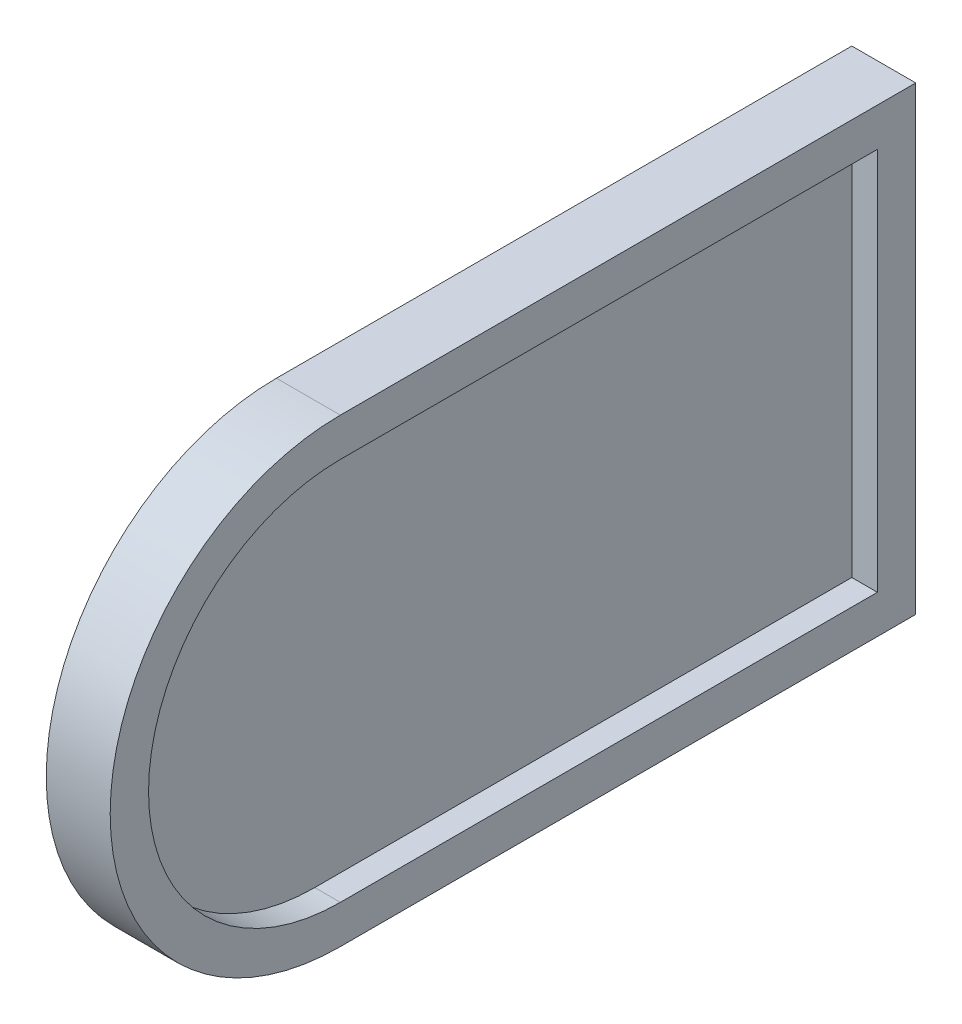
ISO-10303-21;
HEADER;
FILE_DESCRIPTION(('STEP AP214'),'2;1');
FILE_NAME('part.step','',(''),(''),'','','');
FILE_SCHEMA(('AUTOMOTIVE_DESIGN { 1 0 10303 214 1 1 1 1 }'));
ENDSEC;
DATA;
#1=APPLICATION_CONTEXT('core data for automotive mechanical design processes');
#2=APPLICATION_PROTOCOL_DEFINITION('international standard','automotive_design',2000,#1);
#3=PRODUCT_CONTEXT('',#1,'mechanical');
#4=PRODUCT('Part','Part','',(#3));
#5=PRODUCT_RELATED_PRODUCT_CATEGORY('part','',(#4));
#6=PRODUCT_DEFINITION_FORMATION('','',#4);
#7=PRODUCT_DEFINITION_CONTEXT('part definition',#1,'design');
#8=PRODUCT_DEFINITION('design','',#6,#7);
#9=PRODUCT_DEFINITION_SHAPE('','',#8);
#10=(LENGTH_UNIT() NAMED_UNIT(*) SI_UNIT(.MILLI.,.METRE.));
#11=(NAMED_UNIT(*) PLANE_ANGLE_UNIT() SI_UNIT($,.RADIAN.));
#12=(NAMED_UNIT(*) SI_UNIT($,.STERADIAN.) SOLID_ANGLE_UNIT());
#13=UNCERTAINTY_MEASURE_WITH_UNIT(LENGTH_MEASURE(1.E-05),#10,'distance_accuracy_value','');
#14=(GEOMETRIC_REPRESENTATION_CONTEXT(3) GLOBAL_UNCERTAINTY_ASSIGNED_CONTEXT((#13)) GLOBAL_UNIT_ASSIGNED_CONTEXT((#10,
#11,#12)) REPRESENTATION_CONTEXT('',''));
#15=CARTESIAN_POINT('',(0.,0.,0.));
#16=DIRECTION('',(0.,0.,1.));
#17=DIRECTION('',(1.,0.,0.));
#18=AXIS2_PLACEMENT_3D('',#15,#16,#17);
#19=CARTESIAN_POINT('',(5.,0.,0.));
#20=DIRECTION('',(-1.,0.,0.));
#21=DIRECTION('',(0.,0.,1.));
#22=AXIS2_PLACEMENT_3D('',#19,#20,#21);
#23=CYLINDRICAL_SURFACE('',#22,18.);
#24=CARTESIAN_POINT('',(0.,0.,0.));
#25=DIRECTION('',(1.,0.,0.));
#26=DIRECTION('',(0.,0.,-1.));
#27=AXIS2_PLACEMENT_3D('',#24,#25,#26);
#28=CIRCLE('',#27,18.);
#29=CARTESIAN_POINT('',(0.,18.,0.));
#30=VERTEX_POINT('',#29);
#31=CARTESIAN_POINT('',(0.,-18.,0.));
#32=VERTEX_POINT('',#31);
#33=EDGE_CURVE('E151',#30,#32,#28,.T.);
#34=ORIENTED_EDGE('',*,*,#33,.T.);
#35=DIRECTION('',(-1.,0.,0.));
#36=VECTOR('',#35,1.);
#37=CARTESIAN_POINT('',(5.,-18.,0.));
#38=LINE('',#37,#36);
#39=CARTESIAN_POINT('',(5.,-18.,0.));
#40=VERTEX_POINT('',#39);
#41=EDGE_CURVE('E11',#40,#32,#38,.T.);
#42=ORIENTED_EDGE('',*,*,#41,.F.);
#43=CARTESIAN_POINT('',(5.,0.,0.));
#44=DIRECTION('',(1.,0.,0.));
#45=DIRECTION('',(0.,0.,-1.));
#46=AXIS2_PLACEMENT_3D('',#43,#44,#45);
#47=CIRCLE('',#46,18.);
#48=CARTESIAN_POINT('',(5.,18.,0.));
#49=VERTEX_POINT('',#48);
#50=EDGE_CURVE('E144',#49,#40,#47,.T.);
#51=ORIENTED_EDGE('',*,*,#50,.F.);
#52=DIRECTION('',(-1.,0.,0.));
#53=VECTOR('',#52,1.);
#54=CARTESIAN_POINT('',(5.,18.,0.));
#55=LINE('',#54,#53);
#56=EDGE_CURVE('E150',#49,#30,#55,.T.);
#57=ORIENTED_EDGE('',*,*,#56,.T.);
#58=EDGE_LOOP('',(#34,#42,#51,#57));
#59=FACE_BOUND('',#58,.T.);
#60=ADVANCED_FACE('F37',(#59),#23,.T.);
#61=CARTESIAN_POINT('',(5.,-18.,-45.));
#62=DIRECTION('',(0.,1.,0.));
#63=DIRECTION('',(0.,0.,1.));
#64=AXIS2_PLACEMENT_3D('',#61,#62,#63);
#65=PLANE('',#64);
#66=DIRECTION('',(0.,0.,-1.));
#67=VECTOR('',#66,1.);
#68=CARTESIAN_POINT('',(0.,-18.,-45.));
#69=LINE('',#68,#67);
#70=CARTESIAN_POINT('',(0.,-18.,-45.));
#71=VERTEX_POINT('',#70);
#72=EDGE_CURVE('E154',#32,#71,#69,.T.);
#73=ORIENTED_EDGE('',*,*,#72,.T.);
#74=DIRECTION('',(-1.,0.,0.));
#75=VECTOR('',#74,1.);
#76=CARTESIAN_POINT('',(5.,-18.,-45.));
#77=LINE('',#76,#75);
#78=CARTESIAN_POINT('',(5.,-18.,-45.));
#79=VERTEX_POINT('',#78);
#80=EDGE_CURVE('E44',#79,#71,#77,.T.);
#81=ORIENTED_EDGE('',*,*,#80,.F.);
#82=DIRECTION('',(0.,0.,-1.));
#83=VECTOR('',#82,1.);
#84=CARTESIAN_POINT('',(5.,-18.,-45.));
#85=LINE('',#84,#83);
#86=EDGE_CURVE('E88',#40,#79,#85,.T.);
#87=ORIENTED_EDGE('',*,*,#86,.F.);
#88=ORIENTED_EDGE('',*,*,#41,.T.);
#89=EDGE_LOOP('',(#73,#81,#87,#88));
#90=FACE_BOUND('',#89,.T.);
#91=ADVANCED_FACE('F183',(#90),#65,.F.);
#92=CARTESIAN_POINT('',(5.,18.,-45.));
#93=DIRECTION('',(0.,0.,1.));
#94=DIRECTION('',(1.,0.,0.));
#95=AXIS2_PLACEMENT_3D('',#92,#93,#94);
#96=PLANE('',#95);
#97=DIRECTION('',(0.,1.,0.));
#98=VECTOR('',#97,1.);
#99=CARTESIAN_POINT('',(0.,18.,-45.));
#100=LINE('',#99,#98);
#101=CARTESIAN_POINT('',(0.,18.,-45.));
#102=VERTEX_POINT('',#101);
#103=EDGE_CURVE('E156',#71,#102,#100,.T.);
#104=ORIENTED_EDGE('',*,*,#103,.T.);
#105=DIRECTION('',(-1.,0.,0.));
#106=VECTOR('',#105,1.);
#107=CARTESIAN_POINT('',(5.,18.,-45.));
#108=LINE('',#107,#106);
#109=CARTESIAN_POINT('',(5.,18.,-45.));
#110=VERTEX_POINT('',#109);
#111=EDGE_CURVE('E160',#110,#102,#108,.T.);
#112=ORIENTED_EDGE('',*,*,#111,.F.);
#113=DIRECTION('',(0.,1.,0.));
#114=VECTOR('',#113,1.);
#115=CARTESIAN_POINT('',(5.,18.,-45.));
#116=LINE('',#115,#114);
#117=EDGE_CURVE('E147',#79,#110,#116,.T.);
#118=ORIENTED_EDGE('',*,*,#117,.F.);
#119=ORIENTED_EDGE('',*,*,#80,.T.);
#120=EDGE_LOOP('',(#104,#112,#118,#119));
#121=FACE_BOUND('',#120,.T.);
#122=ADVANCED_FACE('F165',(#121),#96,.F.);
#123=CARTESIAN_POINT('',(5.,18.,0.));
#124=DIRECTION('',(0.,-1.,0.));
#125=DIRECTION('',(0.,0.,-1.));
#126=AXIS2_PLACEMENT_3D('',#123,#124,#125);
#127=PLANE('',#126);
#128=DIRECTION('',(0.,0.,1.));
#129=VECTOR('',#128,1.);
#130=CARTESIAN_POINT('',(0.,18.,0.));
#131=LINE('',#130,#129);
#132=EDGE_CURVE('E81',#102,#30,#131,.T.);
#133=ORIENTED_EDGE('',*,*,#132,.T.);
#134=ORIENTED_EDGE('',*,*,#56,.F.);
#135=DIRECTION('',(0.,0.,1.));
#136=VECTOR('',#135,1.);
#137=CARTESIAN_POINT('',(5.,18.,0.));
#138=LINE('',#137,#136);
#139=EDGE_CURVE('E60',#110,#49,#138,.T.);
#140=ORIENTED_EDGE('',*,*,#139,.F.);
#141=ORIENTED_EDGE('',*,*,#111,.T.);
#142=EDGE_LOOP('',(#133,#134,#140,#141));
#143=FACE_BOUND('',#142,.T.);
#144=ADVANCED_FACE('F173',(#143),#127,.F.);
#145=CARTESIAN_POINT('',(5.,0.,0.));
#146=DIRECTION('',(1.,0.,0.));
#147=DIRECTION('',(0.,0.,-1.));
#148=AXIS2_PLACEMENT_3D('',#145,#146,#147);
#149=PLANE('',#148);
#150=CARTESIAN_POINT('',(5.,0.,0.));
#151=DIRECTION('',(1.,0.,0.));
#152=DIRECTION('',(0.,0.,-1.));
#153=AXIS2_PLACEMENT_3D('',#150,#151,#152);
#154=CIRCLE('',#153,15.);
#155=CARTESIAN_POINT('',(5.,15.,0.));
#156=VERTEX_POINT('',#155);
#157=CARTESIAN_POINT('',(5.,-15.,0.));
#158=VERTEX_POINT('',#157);
#159=EDGE_CURVE('E133',#156,#158,#154,.T.);
#160=ORIENTED_EDGE('',*,*,#159,.F.);
#161=DIRECTION('',(0.,0.,1.));
#162=VECTOR('',#161,1.);
#163=CARTESIAN_POINT('',(5.,15.,0.));
#164=LINE('',#163,#162);
#165=CARTESIAN_POINT('',(5.,15.,-42.));
#166=VERTEX_POINT('',#165);
#167=EDGE_CURVE('E142',#166,#156,#164,.T.);
#168=ORIENTED_EDGE('',*,*,#167,.F.);
#169=DIRECTION('',(0.,1.,0.));
#170=VECTOR('',#169,1.);
#171=CARTESIAN_POINT('',(5.,18.,-42.));
#172=LINE('',#171,#170);
#173=CARTESIAN_POINT('',(5.,-15.,-42.));
#174=VERTEX_POINT('',#173);
#175=EDGE_CURVE('E140',#174,#166,#172,.T.);
#176=ORIENTED_EDGE('',*,*,#175,.F.);
#177=DIRECTION('',(0.,0.,-1.));
#178=VECTOR('',#177,1.);
#179=CARTESIAN_POINT('',(5.,-15.,-45.));
#180=LINE('',#179,#178);
#181=EDGE_CURVE('E125',#158,#174,#180,.T.);
#182=ORIENTED_EDGE('',*,*,#181,.F.);
#183=EDGE_LOOP('',(#160,#168,#176,#182));
#184=FACE_BOUND('',#183,.T.);
#185=ORIENTED_EDGE('',*,*,#50,.T.);
#186=ORIENTED_EDGE('',*,*,#86,.T.);
#187=ORIENTED_EDGE('',*,*,#117,.T.);
#188=ORIENTED_EDGE('',*,*,#139,.T.);
#189=EDGE_LOOP('',(#185,#186,#187,#188));
#190=FACE_BOUND('',#189,.T.);
#191=ADVANCED_FACE('F175',(#184,#190),#149,.T.);
#192=CARTESIAN_POINT('',(0.,0.,0.));
#193=DIRECTION('',(1.,0.,0.));
#194=DIRECTION('',(0.,0.,-1.));
#195=AXIS2_PLACEMENT_3D('',#192,#193,#194);
#196=PLANE('',#195);
#197=ORIENTED_EDGE('',*,*,#33,.F.);
#198=ORIENTED_EDGE('',*,*,#132,.F.);
#199=ORIENTED_EDGE('',*,*,#103,.F.);
#200=ORIENTED_EDGE('',*,*,#72,.F.);
#201=EDGE_LOOP('',(#197,#198,#199,#200));
#202=FACE_BOUND('',#201,.T.);
#203=ADVANCED_FACE('F169',(#202),#196,.F.);
#204=CARTESIAN_POINT('',(5.,0.,0.));
#205=DIRECTION('',(-1.,0.,0.));
#206=DIRECTION('',(0.,0.,1.));
#207=AXIS2_PLACEMENT_3D('',#204,#205,#206);
#208=CYLINDRICAL_SURFACE('',#207,15.);
#209=CARTESIAN_POINT('',(3.,0.,0.));
#210=DIRECTION('',(1.,0.,0.));
#211=DIRECTION('',(0.,0.,-1.));
#212=AXIS2_PLACEMENT_3D('',#209,#210,#211);
#213=CIRCLE('',#212,15.);
#214=CARTESIAN_POINT('',(3.,15.,0.));
#215=VERTEX_POINT('',#214);
#216=CARTESIAN_POINT('',(3.,-15.,0.));
#217=VERTEX_POINT('',#216);
#218=EDGE_CURVE('E116',#215,#217,#213,.T.);
#219=ORIENTED_EDGE('',*,*,#218,.F.);
#220=DIRECTION('',(-1.,0.,0.));
#221=VECTOR('',#220,1.);
#222=CARTESIAN_POINT('',(5.,15.,0.));
#223=LINE('',#222,#221);
#224=EDGE_CURVE('E136',#156,#215,#223,.T.);
#225=ORIENTED_EDGE('',*,*,#224,.F.);
#226=ORIENTED_EDGE('',*,*,#159,.T.);
#227=DIRECTION('',(1.,0.,0.));
#228=VECTOR('',#227,1.);
#229=CARTESIAN_POINT('',(5.,-15.,0.));
#230=LINE('',#229,#228);
#231=EDGE_CURVE('E128',#158,#217,#230,.F.);
#232=ORIENTED_EDGE('',*,*,#231,.T.);
#233=EDGE_LOOP('',(#219,#225,#226,#232));
#234=FACE_BOUND('',#233,.T.);
#235=ADVANCED_FACE('F210',(#234),#208,.F.);
#236=CARTESIAN_POINT('',(5.,-15.,-45.));
#237=DIRECTION('',(0.,1.,0.));
#238=DIRECTION('',(0.,0.,1.));
#239=AXIS2_PLACEMENT_3D('',#236,#237,#238);
#240=PLANE('',#239);
#241=DIRECTION('',(0.,0.,-1.));
#242=VECTOR('',#241,1.);
#243=CARTESIAN_POINT('',(3.,-15.,-45.));
#244=LINE('',#243,#242);
#245=CARTESIAN_POINT('',(3.,-15.,-42.));
#246=VERTEX_POINT('',#245);
#247=EDGE_CURVE('E110',#217,#246,#244,.T.);
#248=ORIENTED_EDGE('',*,*,#247,.F.);
#249=ORIENTED_EDGE('',*,*,#231,.F.);
#250=ORIENTED_EDGE('',*,*,#181,.T.);
#251=DIRECTION('',(-1.,0.,0.));
#252=VECTOR('',#251,1.);
#253=CARTESIAN_POINT('',(5.,-15.,-42.));
#254=LINE('',#253,#252);
#255=EDGE_CURVE('E122',#174,#246,#254,.T.);
#256=ORIENTED_EDGE('',*,*,#255,.T.);
#257=EDGE_LOOP('',(#248,#249,#250,#256));
#258=FACE_BOUND('',#257,.T.);
#259=ADVANCED_FACE('F123',(#258),#240,.T.);
#260=CARTESIAN_POINT('',(5.,18.,-42.));
#261=DIRECTION('',(0.,0.,1.));
#262=DIRECTION('',(1.,0.,0.));
#263=AXIS2_PLACEMENT_3D('',#260,#261,#262);
#264=PLANE('',#263);
#265=DIRECTION('',(0.,1.,0.));
#266=VECTOR('',#265,1.);
#267=CARTESIAN_POINT('',(3.,18.,-42.));
#268=LINE('',#267,#266);
#269=CARTESIAN_POINT('',(3.,15.,-42.));
#270=VERTEX_POINT('',#269);
#271=EDGE_CURVE('E114',#246,#270,#268,.T.);
#272=ORIENTED_EDGE('',*,*,#271,.F.);
#273=ORIENTED_EDGE('',*,*,#255,.F.);
#274=ORIENTED_EDGE('',*,*,#175,.T.);
#275=DIRECTION('',(-1.,0.,0.));
#276=VECTOR('',#275,1.);
#277=CARTESIAN_POINT('',(5.,15.,-42.));
#278=LINE('',#277,#276);
#279=EDGE_CURVE('E51',#166,#270,#278,.T.);
#280=ORIENTED_EDGE('',*,*,#279,.T.);
#281=EDGE_LOOP('',(#272,#273,#274,#280));
#282=FACE_BOUND('',#281,.T.);
#283=ADVANCED_FACE('F130',(#282),#264,.T.);
#284=CARTESIAN_POINT('',(5.,15.,0.));
#285=DIRECTION('',(0.,-1.,0.));
#286=DIRECTION('',(0.,0.,-1.));
#287=AXIS2_PLACEMENT_3D('',#284,#285,#286);
#288=PLANE('',#287);
#289=DIRECTION('',(0.,0.,1.));
#290=VECTOR('',#289,1.);
#291=CARTESIAN_POINT('',(3.,15.,0.));
#292=LINE('',#291,#290);
#293=EDGE_CURVE('E131',#270,#215,#292,.T.);
#294=ORIENTED_EDGE('',*,*,#293,.F.);
#295=ORIENTED_EDGE('',*,*,#279,.F.);
#296=ORIENTED_EDGE('',*,*,#167,.T.);
#297=ORIENTED_EDGE('',*,*,#224,.T.);
#298=EDGE_LOOP('',(#294,#295,#296,#297));
#299=FACE_BOUND('',#298,.T.);
#300=ADVANCED_FACE('F240',(#299),#288,.T.);
#301=CARTESIAN_POINT('',(3.,0.,0.));
#302=DIRECTION('',(1.,0.,0.));
#303=DIRECTION('',(0.,0.,-1.));
#304=AXIS2_PLACEMENT_3D('',#301,#302,#303);
#305=PLANE('',#304);
#306=ORIENTED_EDGE('',*,*,#218,.T.);
#307=ORIENTED_EDGE('',*,*,#247,.T.);
#308=ORIENTED_EDGE('',*,*,#271,.T.);
#309=ORIENTED_EDGE('',*,*,#293,.T.);
#310=EDGE_LOOP('',(#306,#307,#308,#309));
#311=FACE_BOUND('',#310,.T.);
#312=ADVANCED_FACE('F112',(#311),#305,.T.);
#313=CLOSED_SHELL('',(#60,#91,#122,#144,#191,#203,#235,#259,#283,#300,#312));
#314=MANIFOLD_SOLID_BREP('B2',#313);
#315=ADVANCED_BREP_SHAPE_REPRESENTATION('',(#18,#314),#14);
#316=SHAPE_DEFINITION_REPRESENTATION(#9,#315);
ENDSEC;
END-ISO-10303-21;
